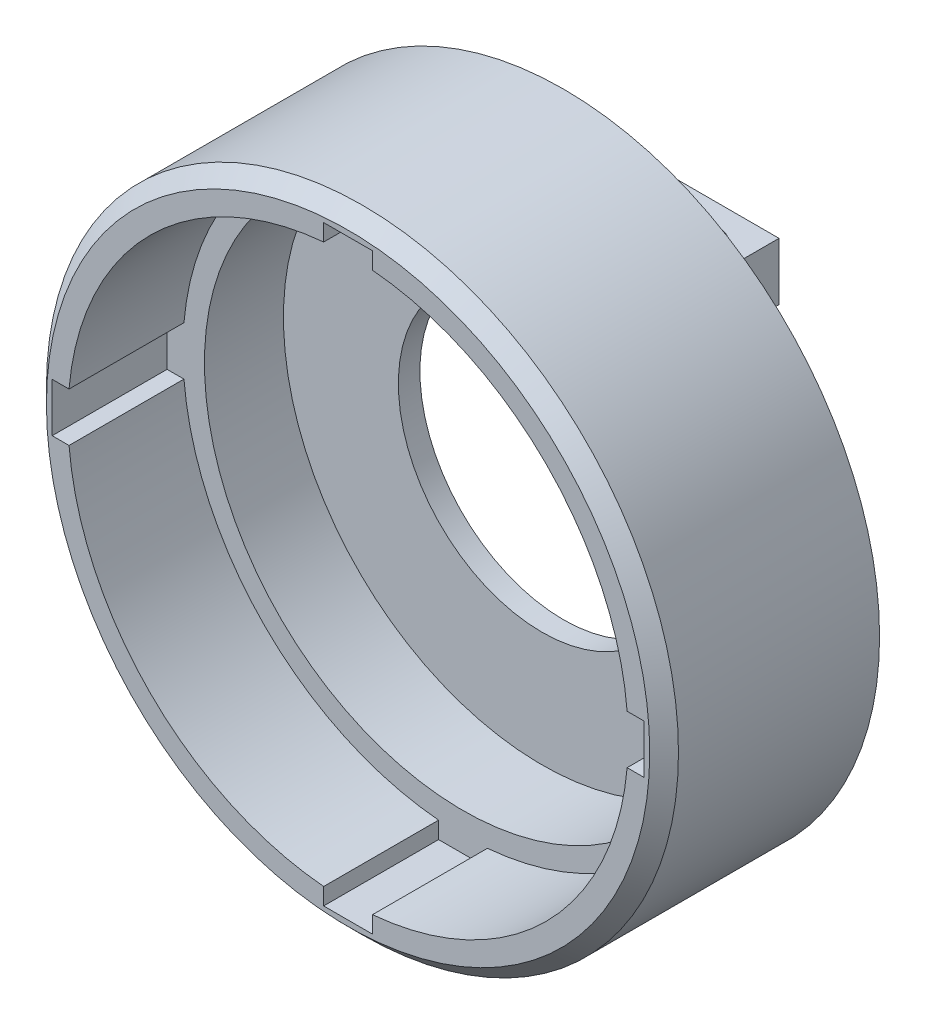
ISO-10303-21;
HEADER;
FILE_DESCRIPTION(('STEP AP214'),'2;1');
FILE_NAME('part.step','',(''),(''),'','','');
FILE_SCHEMA(('AUTOMOTIVE_DESIGN { 1 0 10303 214 1 1 1 1 }'));
ENDSEC;
DATA;
#1=APPLICATION_CONTEXT('core data for automotive mechanical design processes');
#2=APPLICATION_PROTOCOL_DEFINITION('international standard','automotive_design',2000,#1);
#3=PRODUCT_CONTEXT('',#1,'mechanical');
#4=PRODUCT('Part','Part','',(#3));
#5=PRODUCT_RELATED_PRODUCT_CATEGORY('part','',(#4));
#6=PRODUCT_DEFINITION_FORMATION('','',#4);
#7=PRODUCT_DEFINITION_CONTEXT('part definition',#1,'design');
#8=PRODUCT_DEFINITION('design','',#6,#7);
#9=PRODUCT_DEFINITION_SHAPE('','',#8);
#10=(LENGTH_UNIT() NAMED_UNIT(*) SI_UNIT(.MILLI.,.METRE.));
#11=(NAMED_UNIT(*) PLANE_ANGLE_UNIT() SI_UNIT($,.RADIAN.));
#12=(NAMED_UNIT(*) SI_UNIT($,.STERADIAN.) SOLID_ANGLE_UNIT());
#13=UNCERTAINTY_MEASURE_WITH_UNIT(LENGTH_MEASURE(1.E-05),#10,'distance_accuracy_value','');
#14=(GEOMETRIC_REPRESENTATION_CONTEXT(3) GLOBAL_UNCERTAINTY_ASSIGNED_CONTEXT((#13)) GLOBAL_UNIT_ASSIGNED_CONTEXT((#10,
#11,#12)) REPRESENTATION_CONTEXT('',''));
#15=CARTESIAN_POINT('',(0.,0.,0.));
#16=DIRECTION('',(0.,0.,1.));
#17=DIRECTION('',(1.,0.,0.));
#18=AXIS2_PLACEMENT_3D('',#15,#16,#17);
#19=CARTESIAN_POINT('',(0.,0.,-6.75));
#20=DIRECTION('',(0.,0.,-1.));
#21=DIRECTION('',(-1.,0.,0.));
#22=AXIS2_PLACEMENT_3D('',#19,#20,#21);
#23=PLANE('',#22);
#24=DIRECTION('',(0.,1.,0.));
#25=VECTOR('',#24,1.);
#26=CARTESIAN_POINT('',(-5.,0.,-6.75));
#27=LINE('',#26,#25);
#28=CARTESIAN_POINT('',(-5.,8.66025403784439,-6.75));
#29=VERTEX_POINT('',#28);
#30=CARTESIAN_POINT('',(-5.,11.5,-6.75));
#31=VERTEX_POINT('',#30);
#32=EDGE_CURVE('E265',#29,#31,#27,.T.);
#33=ORIENTED_EDGE('',*,*,#32,.F.);
#34=CARTESIAN_POINT('',(0.,0.,-6.75));
#35=DIRECTION('',(0.,0.,-1.));
#36=DIRECTION('',(-1.,0.,0.));
#37=AXIS2_PLACEMENT_3D('',#34,#35,#36);
#38=CIRCLE('',#37,10.);
#39=CARTESIAN_POINT('',(5.,8.66025403784439,-6.75));
#40=VERTEX_POINT('',#39);
#41=EDGE_CURVE('E294',#29,#40,#38,.F.);
#42=ORIENTED_EDGE('',*,*,#41,.T.);
#43=DIRECTION('',(0.,1.,0.));
#44=VECTOR('',#43,1.);
#45=CARTESIAN_POINT('',(5.,0.,-6.75));
#46=LINE('',#45,#44);
#47=CARTESIAN_POINT('',(5.,11.5,-6.75));
#48=VERTEX_POINT('',#47);
#49=EDGE_CURVE('E246',#40,#48,#46,.T.);
#50=ORIENTED_EDGE('',*,*,#49,.T.);
#51=DIRECTION('',(1.,0.,0.));
#52=VECTOR('',#51,1.);
#53=CARTESIAN_POINT('',(0.,11.5,-6.75));
#54=LINE('',#53,#52);
#55=CARTESIAN_POINT('',(9.99999999999999,11.5,-6.75));
#56=VERTEX_POINT('',#55);
#57=EDGE_CURVE('E250',#48,#56,#54,.T.);
#58=ORIENTED_EDGE('',*,*,#57,.T.);
#59=DIRECTION('',(0.,1.,0.));
#60=VECTOR('',#59,1.);
#61=CARTESIAN_POINT('',(9.99999999999997,0.,-6.75));
#62=LINE('',#61,#60);
#63=CARTESIAN_POINT('',(10.,15.5,-6.75));
#64=VERTEX_POINT('',#63);
#65=EDGE_CURVE('E276',#56,#64,#62,.T.);
#66=ORIENTED_EDGE('',*,*,#65,.T.);
#67=DIRECTION('',(-1.,0.,0.));
#68=VECTOR('',#67,1.);
#69=CARTESIAN_POINT('',(0.,15.5,-6.75));
#70=LINE('',#69,#68);
#71=CARTESIAN_POINT('',(-10.,15.5,-6.75));
#72=VERTEX_POINT('',#71);
#73=EDGE_CURVE('E273',#64,#72,#70,.T.);
#74=ORIENTED_EDGE('',*,*,#73,.T.);
#75=DIRECTION('',(0.,-1.,0.));
#76=VECTOR('',#75,1.);
#77=CARTESIAN_POINT('',(-10.,0.,-6.75));
#78=LINE('',#77,#76);
#79=CARTESIAN_POINT('',(-10.,11.5,-6.75));
#80=VERTEX_POINT('',#79);
#81=EDGE_CURVE('E270',#72,#80,#78,.T.);
#82=ORIENTED_EDGE('',*,*,#81,.T.);
#83=DIRECTION('',(1.,0.,0.));
#84=VECTOR('',#83,1.);
#85=CARTESIAN_POINT('',(0.,11.5,-6.75));
#86=LINE('',#85,#84);
#87=EDGE_CURVE('E267',#80,#31,#86,.T.);
#88=ORIENTED_EDGE('',*,*,#87,.T.);
#89=EDGE_LOOP('',(#33,#42,#50,#58,#66,#74,#82,#88));
#90=FACE_BOUND('',#89,.T.);
#91=CARTESIAN_POINT('',(0.,0.,-6.75));
#92=DIRECTION('',(0.,0.,-1.));
#93=DIRECTION('',(-1.,0.,0.));
#94=AXIS2_PLACEMENT_3D('',#91,#92,#93);
#95=CIRCLE('',#94,22.);
#96=CARTESIAN_POINT('',(-22.,0.,-6.75));
#97=VERTEX_POINT('',#96);
#98=EDGE_CURVE('E291',#97,#97,#95,.T.);
#99=ORIENTED_EDGE('',*,*,#98,.T.);
#100=EDGE_LOOP('',(#99));
#101=FACE_BOUND('',#100,.T.);
#102=ADVANCED_FACE('F35',(#90,#101),#23,.T.);
#103=CARTESIAN_POINT('',(0.,0.,8.25));
#104=DIRECTION('',(0.,0.,-1.));
#105=DIRECTION('',(-1.,0.,0.));
#106=AXIS2_PLACEMENT_3D('',#103,#104,#105);
#107=CYLINDRICAL_SURFACE('',#106,22.);
#108=CARTESIAN_POINT('',(0.,0.,7.24999999999999));
#109=DIRECTION('',(0.,0.,1.));
#110=DIRECTION('',(1.,0.,0.));
#111=AXIS2_PLACEMENT_3D('',#108,#109,#110);
#112=CIRCLE('',#111,22.);
#113=CARTESIAN_POINT('',(22.,0.,7.24999999999999));
#114=VERTEX_POINT('',#113);
#115=EDGE_CURVE('E44',#114,#114,#112,.F.);
#116=ORIENTED_EDGE('',*,*,#115,.T.);
#117=EDGE_LOOP('',(#116));
#118=FACE_BOUND('',#117,.T.);
#119=ORIENTED_EDGE('',*,*,#98,.F.);
#120=EDGE_LOOP('',(#119));
#121=FACE_BOUND('',#120,.T.);
#122=ADVANCED_FACE('F418',(#118,#121),#107,.T.);
#123=CARTESIAN_POINT('',(0.,0.,8.25));
#124=DIRECTION('',(0.,0.,-1.));
#125=DIRECTION('',(-1.,0.,0.));
#126=AXIS2_PLACEMENT_3D('',#123,#124,#125);
#127=CYLINDRICAL_SURFACE('',#126,10.);
#128=ORIENTED_EDGE('',*,*,#41,.F.);
#129=DIRECTION('',(0.,0.,-1.));
#130=VECTOR('',#129,1.);
#131=CARTESIAN_POINT('',(-5.,8.66025403784439,8.25));
#132=LINE('',#131,#130);
#133=CARTESIAN_POINT('',(-5.,8.66025403784439,-5.25));
#134=VERTEX_POINT('',#133);
#135=EDGE_CURVE('E240',#29,#134,#132,.F.);
#136=ORIENTED_EDGE('',*,*,#135,.T.);
#137=CARTESIAN_POINT('',(0.,0.,-5.25));
#138=DIRECTION('',(0.,0.,1.));
#139=DIRECTION('',(1.,0.,0.));
#140=AXIS2_PLACEMENT_3D('',#137,#138,#139);
#141=CIRCLE('',#140,10.);
#142=CARTESIAN_POINT('',(5.,8.66025403784439,-5.25));
#143=VERTEX_POINT('',#142);
#144=EDGE_CURVE('E357',#134,#143,#141,.T.);
#145=ORIENTED_EDGE('',*,*,#144,.T.);
#146=DIRECTION('',(0.,0.,-1.));
#147=VECTOR('',#146,1.);
#148=CARTESIAN_POINT('',(5.,8.66025403784439,8.25));
#149=LINE('',#148,#147);
#150=EDGE_CURVE('E237',#143,#40,#149,.T.);
#151=ORIENTED_EDGE('',*,*,#150,.T.);
#152=EDGE_LOOP('',(#128,#136,#145,#151));
#153=FACE_BOUND('',#152,.T.);
#154=ADVANCED_FACE('F498',(#153),#127,.F.);
#155=CARTESIAN_POINT('',(0.,0.,0.25));
#156=DIRECTION('',(0.,0.,1.));
#157=DIRECTION('',(1.,0.,0.));
#158=AXIS2_PLACEMENT_3D('',#155,#156,#157);
#159=CYLINDRICAL_SURFACE('',#158,19.5);
#160=CARTESIAN_POINT('',(0.,0.,0.25));
#161=DIRECTION('',(0.,0.,1.));
#162=DIRECTION('',(1.,0.,0.));
#163=AXIS2_PLACEMENT_3D('',#160,#161,#162);
#164=CIRCLE('',#163,19.5);
#165=CARTESIAN_POINT('',(-19.4257560985409,-1.70000000000007,0.25));
#166=VERTEX_POINT('',#165);
#167=CARTESIAN_POINT('',(-1.7,-19.4257560985409,0.25));
#168=VERTEX_POINT('',#167);
#169=EDGE_CURVE('E372',#166,#168,#164,.T.);
#170=ORIENTED_EDGE('',*,*,#169,.F.);
#171=DIRECTION('',(0.,0.,1.));
#172=VECTOR('',#171,1.);
#173=CARTESIAN_POINT('',(-19.4257560985409,-1.70000000000007,0.25));
#174=LINE('',#173,#172);
#175=CARTESIAN_POINT('',(-19.4257560985409,-1.70000000000007,8.25));
#176=VERTEX_POINT('',#175);
#177=EDGE_CURVE('E407',#166,#176,#174,.T.);
#178=ORIENTED_EDGE('',*,*,#177,.T.);
#179=CARTESIAN_POINT('',(0.,0.,8.25));
#180=DIRECTION('',(0.,0.,1.));
#181=DIRECTION('',(1.,0.,0.));
#182=AXIS2_PLACEMENT_3D('',#179,#180,#181);
#183=CIRCLE('',#182,19.5);
#184=CARTESIAN_POINT('',(-1.7,-19.4257560985409,8.25));
#185=VERTEX_POINT('',#184);
#186=EDGE_CURVE('E377',#176,#185,#183,.T.);
#187=ORIENTED_EDGE('',*,*,#186,.T.);
#188=DIRECTION('',(0.,0.,1.));
#189=VECTOR('',#188,1.);
#190=CARTESIAN_POINT('',(-1.7,-19.4257560985409,0.25));
#191=LINE('',#190,#189);
#192=EDGE_CURVE('E398',#185,#168,#191,.F.);
#193=ORIENTED_EDGE('',*,*,#192,.T.);
#194=EDGE_LOOP('',(#170,#178,#187,#193));
#195=FACE_BOUND('',#194,.T.);
#196=ADVANCED_FACE('F445',(#195),#159,.F.);
#197=CARTESIAN_POINT('',(1.7,-19.4257560985409,0.25));
#198=VERTEX_POINT('',#197);
#199=CARTESIAN_POINT('',(19.4257560985409,-1.6999999999998,0.25));
#200=VERTEX_POINT('',#199);
#201=EDGE_CURVE('E448',#198,#200,#164,.T.);
#202=ORIENTED_EDGE('',*,*,#201,.F.);
#203=DIRECTION('',(0.,0.,1.));
#204=VECTOR('',#203,1.);
#205=CARTESIAN_POINT('',(1.7,-19.4257560985409,0.25));
#206=LINE('',#205,#204);
#207=CARTESIAN_POINT('',(1.7,-19.4257560985409,8.25));
#208=VERTEX_POINT('',#207);
#209=EDGE_CURVE('E401',#198,#208,#206,.T.);
#210=ORIENTED_EDGE('',*,*,#209,.T.);
#211=CARTESIAN_POINT('',(19.4257560985409,-1.6999999999998,8.25));
#212=VERTEX_POINT('',#211);
#213=EDGE_CURVE('E464',#208,#212,#183,.T.);
#214=ORIENTED_EDGE('',*,*,#213,.T.);
#215=DIRECTION('',(0.,0.,1.));
#216=VECTOR('',#215,1.);
#217=CARTESIAN_POINT('',(19.4257560985409,-1.6999999999998,0.25));
#218=LINE('',#217,#216);
#219=EDGE_CURVE('E392',#212,#200,#218,.F.);
#220=ORIENTED_EDGE('',*,*,#219,.T.);
#221=EDGE_LOOP('',(#202,#210,#214,#220));
#222=FACE_BOUND('',#221,.T.);
#223=ADVANCED_FACE('F468',(#222),#159,.F.);
#224=CARTESIAN_POINT('',(19.4257560985409,1.7000000000002,0.25));
#225=VERTEX_POINT('',#224);
#226=CARTESIAN_POINT('',(1.7,19.4257560985409,0.25));
#227=VERTEX_POINT('',#226);
#228=EDGE_CURVE('E373',#225,#227,#164,.T.);
#229=ORIENTED_EDGE('',*,*,#228,.F.);
#230=DIRECTION('',(0.,0.,1.));
#231=VECTOR('',#230,1.);
#232=CARTESIAN_POINT('',(19.4257560985409,1.7000000000002,0.25));
#233=LINE('',#232,#231);
#234=CARTESIAN_POINT('',(19.4257560985409,1.7000000000002,8.25));
#235=VERTEX_POINT('',#234);
#236=EDGE_CURVE('E395',#225,#235,#233,.T.);
#237=ORIENTED_EDGE('',*,*,#236,.T.);
#238=CARTESIAN_POINT('',(1.7,19.4257560985409,8.25));
#239=VERTEX_POINT('',#238);
#240=EDGE_CURVE('E378',#235,#239,#183,.T.);
#241=ORIENTED_EDGE('',*,*,#240,.T.);
#242=DIRECTION('',(0.,0.,1.));
#243=VECTOR('',#242,1.);
#244=CARTESIAN_POINT('',(1.7,19.4257560985409,0.25));
#245=LINE('',#244,#243);
#246=EDGE_CURVE('E382',#239,#227,#245,.F.);
#247=ORIENTED_EDGE('',*,*,#246,.T.);
#248=EDGE_LOOP('',(#229,#237,#241,#247));
#249=FACE_BOUND('',#248,.T.);
#250=ADVANCED_FACE('F431',(#249),#159,.F.);
#251=CARTESIAN_POINT('',(0.,0.,8.25));
#252=DIRECTION('',(0.,0.,1.));
#253=DIRECTION('',(1.,0.,0.));
#254=AXIS2_PLACEMENT_3D('',#251,#252,#253);
#255=PLANE('',#254);
#256=CARTESIAN_POINT('',(0.,0.,8.25));
#257=DIRECTION('',(0.,0.,1.));
#258=DIRECTION('',(1.,0.,0.));
#259=AXIS2_PLACEMENT_3D('',#256,#257,#258);
#260=CIRCLE('',#259,21.);
#261=CARTESIAN_POINT('',(21.,0.,8.25));
#262=VERTEX_POINT('',#261);
#263=EDGE_CURVE('E410',#262,#262,#260,.T.);
#264=ORIENTED_EDGE('',*,*,#263,.T.);
#265=EDGE_LOOP('',(#264));
#266=FACE_BOUND('',#265,.T.);
#267=DIRECTION('',(1.,0.,0.));
#268=VECTOR('',#267,1.);
#269=CARTESIAN_POINT('',(-20.6,-1.70000000000007,8.25));
#270=LINE('',#269,#268);
#271=CARTESIAN_POINT('',(-20.6,-1.70000000000007,8.25));
#272=VERTEX_POINT('',#271);
#273=EDGE_CURVE('E303',#272,#176,#270,.T.);
#274=ORIENTED_EDGE('',*,*,#273,.F.);
#275=DIRECTION('',(0.,-1.,0.));
#276=VECTOR('',#275,1.);
#277=CARTESIAN_POINT('',(-20.6,1.69999999999993,8.25));
#278=LINE('',#277,#276);
#279=CARTESIAN_POINT('',(-20.6,1.69999999999993,8.25));
#280=VERTEX_POINT('',#279);
#281=EDGE_CURVE('E308',#280,#272,#278,.T.);
#282=ORIENTED_EDGE('',*,*,#281,.F.);
#283=DIRECTION('',(-1.,0.,0.));
#284=VECTOR('',#283,1.);
#285=CARTESIAN_POINT('',(-20.6,1.69999999999993,8.25));
#286=LINE('',#285,#284);
#287=CARTESIAN_POINT('',(-19.4257560985409,1.69999999999993,8.25));
#288=VERTEX_POINT('',#287);
#289=EDGE_CURVE('E305',#288,#280,#286,.T.);
#290=ORIENTED_EDGE('',*,*,#289,.F.);
#291=CARTESIAN_POINT('',(-1.7,19.4257560985409,8.25));
#292=VERTEX_POINT('',#291);
#293=EDGE_CURVE('E374',#292,#288,#183,.T.);
#294=ORIENTED_EDGE('',*,*,#293,.F.);
#295=DIRECTION('',(0.,-1.,0.));
#296=VECTOR('',#295,1.);
#297=CARTESIAN_POINT('',(-1.7,20.6,8.25));
#298=LINE('',#297,#296);
#299=CARTESIAN_POINT('',(-1.7,20.6,8.25));
#300=VERTEX_POINT('',#299);
#301=EDGE_CURVE('E302',#300,#292,#298,.T.);
#302=ORIENTED_EDGE('',*,*,#301,.F.);
#303=DIRECTION('',(-1.,0.,0.));
#304=VECTOR('',#303,1.);
#305=CARTESIAN_POINT('',(1.7,20.6,8.25));
#306=LINE('',#305,#304);
#307=CARTESIAN_POINT('',(1.7,20.6,8.25));
#308=VERTEX_POINT('',#307);
#309=EDGE_CURVE('E361',#308,#300,#306,.T.);
#310=ORIENTED_EDGE('',*,*,#309,.F.);
#311=DIRECTION('',(0.,1.,0.));
#312=VECTOR('',#311,1.);
#313=CARTESIAN_POINT('',(1.7,20.6,8.25));
#314=LINE('',#313,#312);
#315=EDGE_CURVE('E359',#239,#308,#314,.T.);
#316=ORIENTED_EDGE('',*,*,#315,.F.);
#317=ORIENTED_EDGE('',*,*,#240,.F.);
#318=DIRECTION('',(-1.,0.,0.));
#319=VECTOR('',#318,1.);
#320=CARTESIAN_POINT('',(20.6,1.70000000000021,8.25));
#321=LINE('',#320,#319);
#322=CARTESIAN_POINT('',(20.6,1.70000000000021,8.25));
#323=VERTEX_POINT('',#322);
#324=EDGE_CURVE('E338',#323,#235,#321,.T.);
#325=ORIENTED_EDGE('',*,*,#324,.F.);
#326=DIRECTION('',(0.,1.,0.));
#327=VECTOR('',#326,1.);
#328=CARTESIAN_POINT('',(20.6,-1.69999999999979,8.25));
#329=LINE('',#328,#327);
#330=CARTESIAN_POINT('',(20.6,-1.69999999999979,8.25));
#331=VERTEX_POINT('',#330);
#332=EDGE_CURVE('E342',#331,#323,#329,.T.);
#333=ORIENTED_EDGE('',*,*,#332,.F.);
#334=DIRECTION('',(1.,0.,0.));
#335=VECTOR('',#334,1.);
#336=CARTESIAN_POINT('',(20.6,-1.69999999999979,8.25));
#337=LINE('',#336,#335);
#338=EDGE_CURVE('E340',#212,#331,#337,.T.);
#339=ORIENTED_EDGE('',*,*,#338,.F.);
#340=ORIENTED_EDGE('',*,*,#213,.F.);
#341=DIRECTION('',(0.,1.,0.));
#342=VECTOR('',#341,1.);
#343=CARTESIAN_POINT('',(1.7,-20.6,8.25));
#344=LINE('',#343,#342);
#345=CARTESIAN_POINT('',(1.7,-20.6,8.25));
#346=VERTEX_POINT('',#345);
#347=EDGE_CURVE('E321',#346,#208,#344,.T.);
#348=ORIENTED_EDGE('',*,*,#347,.F.);
#349=DIRECTION('',(1.,0.,0.));
#350=VECTOR('',#349,1.);
#351=CARTESIAN_POINT('',(-1.7,-20.6,8.25));
#352=LINE('',#351,#350);
#353=CARTESIAN_POINT('',(-1.7,-20.6,8.25));
#354=VERTEX_POINT('',#353);
#355=EDGE_CURVE('E325',#354,#346,#352,.T.);
#356=ORIENTED_EDGE('',*,*,#355,.F.);
#357=DIRECTION('',(0.,-1.,0.));
#358=VECTOR('',#357,1.);
#359=CARTESIAN_POINT('',(-1.7,-20.6,8.25));
#360=LINE('',#359,#358);
#361=EDGE_CURVE('E323',#185,#354,#360,.T.);
#362=ORIENTED_EDGE('',*,*,#361,.F.);
#363=ORIENTED_EDGE('',*,*,#186,.F.);
#364=EDGE_LOOP('',(#274,#282,#290,#294,#302,#310,#316,#317,#325,#333,#339,#340,#348,#356,#362,#363));
#365=FACE_BOUND('',#364,.T.);
#366=ADVANCED_FACE('F427',(#266,#365),#255,.T.);
#367=CARTESIAN_POINT('',(0.,0.,0.25));
#368=DIRECTION('',(0.,0.,1.));
#369=DIRECTION('',(1.,0.,0.));
#370=AXIS2_PLACEMENT_3D('',#367,#368,#369);
#371=PLANE('',#370);
#372=CARTESIAN_POINT('',(-1.7,19.4257560985409,0.25));
#373=VERTEX_POINT('',#372);
#374=CARTESIAN_POINT('',(-19.4257560985409,1.69999999999993,0.25));
#375=VERTEX_POINT('',#374);
#376=EDGE_CURVE('E368',#373,#375,#164,.T.);
#377=ORIENTED_EDGE('',*,*,#376,.T.);
#378=DIRECTION('',(1.,0.,0.));
#379=VECTOR('',#378,1.);
#380=CARTESIAN_POINT('',(-20.6,1.69999999999993,0.25));
#381=LINE('',#380,#379);
#382=CARTESIAN_POINT('',(-20.6,1.69999999999993,0.25));
#383=VERTEX_POINT('',#382);
#384=EDGE_CURVE('E295',#383,#375,#381,.T.);
#385=ORIENTED_EDGE('',*,*,#384,.F.);
#386=DIRECTION('',(0.,1.,0.));
#387=VECTOR('',#386,1.);
#388=CARTESIAN_POINT('',(-20.6,1.69999999999993,0.25));
#389=LINE('',#388,#387);
#390=CARTESIAN_POINT('',(-20.6,-1.70000000000007,0.25));
#391=VERTEX_POINT('',#390);
#392=EDGE_CURVE('E297',#391,#383,#389,.T.);
#393=ORIENTED_EDGE('',*,*,#392,.F.);
#394=DIRECTION('',(-1.,0.,0.));
#395=VECTOR('',#394,1.);
#396=CARTESIAN_POINT('',(-20.6,-1.70000000000007,0.25));
#397=LINE('',#396,#395);
#398=EDGE_CURVE('E300',#166,#391,#397,.T.);
#399=ORIENTED_EDGE('',*,*,#398,.F.);
#400=ORIENTED_EDGE('',*,*,#169,.T.);
#401=DIRECTION('',(0.,1.,0.));
#402=VECTOR('',#401,1.);
#403=CARTESIAN_POINT('',(-1.7,-20.6,0.25));
#404=LINE('',#403,#402);
#405=CARTESIAN_POINT('',(-1.7,-20.6,0.25));
#406=VERTEX_POINT('',#405);
#407=EDGE_CURVE('E315',#406,#168,#404,.T.);
#408=ORIENTED_EDGE('',*,*,#407,.F.);
#409=DIRECTION('',(-1.,0.,0.));
#410=VECTOR('',#409,1.);
#411=CARTESIAN_POINT('',(-1.7,-20.6,0.25));
#412=LINE('',#411,#410);
#413=CARTESIAN_POINT('',(1.7,-20.6,0.25));
#414=VERTEX_POINT('',#413);
#415=EDGE_CURVE('E317',#414,#406,#412,.T.);
#416=ORIENTED_EDGE('',*,*,#415,.F.);
#417=DIRECTION('',(0.,-1.,0.));
#418=VECTOR('',#417,1.);
#419=CARTESIAN_POINT('',(1.7,-20.6,0.25));
#420=LINE('',#419,#418);
#421=EDGE_CURVE('E306',#198,#414,#420,.T.);
#422=ORIENTED_EDGE('',*,*,#421,.F.);
#423=ORIENTED_EDGE('',*,*,#201,.T.);
#424=DIRECTION('',(-1.,0.,0.));
#425=VECTOR('',#424,1.);
#426=CARTESIAN_POINT('',(20.6,-1.69999999999979,0.25));
#427=LINE('',#426,#425);
#428=CARTESIAN_POINT('',(20.6,-1.69999999999979,0.25));
#429=VERTEX_POINT('',#428);
#430=EDGE_CURVE('E332',#429,#200,#427,.T.);
#431=ORIENTED_EDGE('',*,*,#430,.F.);
#432=DIRECTION('',(0.,-1.,0.));
#433=VECTOR('',#432,1.);
#434=CARTESIAN_POINT('',(20.6,-1.69999999999979,0.25));
#435=LINE('',#434,#433);
#436=CARTESIAN_POINT('',(20.6,1.70000000000021,0.25));
#437=VERTEX_POINT('',#436);
#438=EDGE_CURVE('E334',#437,#429,#435,.T.);
#439=ORIENTED_EDGE('',*,*,#438,.F.);
#440=DIRECTION('',(1.,0.,0.));
#441=VECTOR('',#440,1.);
#442=CARTESIAN_POINT('',(20.6,1.70000000000021,0.25));
#443=LINE('',#442,#441);
#444=EDGE_CURVE('E59',#225,#437,#443,.T.);
#445=ORIENTED_EDGE('',*,*,#444,.F.);
#446=ORIENTED_EDGE('',*,*,#228,.T.);
#447=DIRECTION('',(0.,-1.,0.));
#448=VECTOR('',#447,1.);
#449=CARTESIAN_POINT('',(1.7,20.6,0.25));
#450=LINE('',#449,#448);
#451=CARTESIAN_POINT('',(1.7,20.6,0.25));
#452=VERTEX_POINT('',#451);
#453=EDGE_CURVE('E349',#452,#227,#450,.T.);
#454=ORIENTED_EDGE('',*,*,#453,.F.);
#455=DIRECTION('',(1.,0.,0.));
#456=VECTOR('',#455,1.);
#457=CARTESIAN_POINT('',(1.7,20.6,0.25));
#458=LINE('',#457,#456);
#459=CARTESIAN_POINT('',(-1.7,20.6,0.25));
#460=VERTEX_POINT('',#459);
#461=EDGE_CURVE('E352',#460,#452,#458,.T.);
#462=ORIENTED_EDGE('',*,*,#461,.F.);
#463=DIRECTION('',(0.,1.,0.));
#464=VECTOR('',#463,1.);
#465=CARTESIAN_POINT('',(-1.7,20.6,0.25));
#466=LINE('',#465,#464);
#467=EDGE_CURVE('E355',#373,#460,#466,.T.);
#468=ORIENTED_EDGE('',*,*,#467,.F.);
#469=EDGE_LOOP('',(#377,#385,#393,#399,#400,#408,#416,#422,#423,#431,#439,#445,#446,#454,#462,#468));
#470=FACE_BOUND('',#469,.T.);
#471=CARTESIAN_POINT('',(0.,0.,0.25));
#472=DIRECTION('',(0.,0.,1.));
#473=DIRECTION('',(1.,0.,0.));
#474=AXIS2_PLACEMENT_3D('',#471,#472,#473);
#475=CIRCLE('',#474,18.);
#476=CARTESIAN_POINT('',(18.,0.,0.25));
#477=VERTEX_POINT('',#476);
#478=EDGE_CURVE('E371',#477,#477,#475,.F.);
#479=ORIENTED_EDGE('',*,*,#478,.T.);
#480=EDGE_LOOP('',(#479));
#481=FACE_BOUND('',#480,.T.);
#482=ADVANCED_FACE('F430',(#470,#481),#371,.T.);
#483=ORIENTED_EDGE('',*,*,#293,.T.);
#484=DIRECTION('',(0.,0.,1.));
#485=VECTOR('',#484,1.);
#486=CARTESIAN_POINT('',(-19.4257560985409,1.69999999999993,0.25));
#487=LINE('',#486,#485);
#488=EDGE_CURVE('E404',#288,#375,#487,.F.);
#489=ORIENTED_EDGE('',*,*,#488,.T.);
#490=ORIENTED_EDGE('',*,*,#376,.F.);
#491=DIRECTION('',(0.,0.,1.));
#492=VECTOR('',#491,1.);
#493=CARTESIAN_POINT('',(-1.7,19.4257560985409,0.25));
#494=LINE('',#493,#492);
#495=EDGE_CURVE('E389',#373,#292,#494,.T.);
#496=ORIENTED_EDGE('',*,*,#495,.T.);
#497=EDGE_LOOP('',(#483,#489,#490,#496));
#498=FACE_BOUND('',#497,.T.);
#499=ADVANCED_FACE('F702',(#498),#159,.F.);
#500=CARTESIAN_POINT('',(0.,0.,-5.25));
#501=DIRECTION('',(0.,0.,1.));
#502=DIRECTION('',(1.,0.,0.));
#503=AXIS2_PLACEMENT_3D('',#500,#501,#502);
#504=PLANE('',#503);
#505=DIRECTION('',(0.,-1.,0.));
#506=VECTOR('',#505,1.);
#507=CARTESIAN_POINT('',(-5.,0.,-5.25));
#508=LINE('',#507,#506);
#509=CARTESIAN_POINT('',(-5.,13.5,-5.25));
#510=VERTEX_POINT('',#509);
#511=EDGE_CURVE('E243',#510,#134,#508,.T.);
#512=ORIENTED_EDGE('',*,*,#511,.F.);
#513=DIRECTION('',(-1.,0.,0.));
#514=VECTOR('',#513,1.);
#515=CARTESIAN_POINT('',(0.,13.5,-5.25));
#516=LINE('',#515,#514);
#517=CARTESIAN_POINT('',(5.,13.5,-5.25));
#518=VERTEX_POINT('',#517);
#519=EDGE_CURVE('E211',#518,#510,#516,.T.);
#520=ORIENTED_EDGE('',*,*,#519,.F.);
#521=DIRECTION('',(0.,1.,0.));
#522=VECTOR('',#521,1.);
#523=CARTESIAN_POINT('',(5.,0.,-5.25));
#524=LINE('',#523,#522);
#525=EDGE_CURVE('E214',#143,#518,#524,.T.);
#526=ORIENTED_EDGE('',*,*,#525,.F.);
#527=ORIENTED_EDGE('',*,*,#144,.F.);
#528=EDGE_LOOP('',(#512,#520,#526,#527));
#529=FACE_BOUND('',#528,.T.);
#530=CARTESIAN_POINT('',(0.,0.,-5.25));
#531=DIRECTION('',(0.,0.,1.));
#532=DIRECTION('',(1.,0.,0.));
#533=AXIS2_PLACEMENT_3D('',#530,#531,#532);
#534=CIRCLE('',#533,18.);
#535=CARTESIAN_POINT('',(18.,0.,-5.25));
#536=VERTEX_POINT('',#535);
#537=EDGE_CURVE('E379',#536,#536,#534,.T.);
#538=ORIENTED_EDGE('',*,*,#537,.T.);
#539=EDGE_LOOP('',(#538));
#540=FACE_BOUND('',#539,.T.);
#541=ADVANCED_FACE('F709',(#529,#540),#504,.T.);
#542=CARTESIAN_POINT('',(0.,0.,-5.25));
#543=DIRECTION('',(0.,0.,1.));
#544=DIRECTION('',(1.,0.,0.));
#545=AXIS2_PLACEMENT_3D('',#542,#543,#544);
#546=CYLINDRICAL_SURFACE('',#545,18.);
#547=ORIENTED_EDGE('',*,*,#537,.F.);
#548=EDGE_LOOP('',(#547));
#549=FACE_BOUND('',#548,.T.);
#550=ORIENTED_EDGE('',*,*,#478,.F.);
#551=EDGE_LOOP('',(#550));
#552=FACE_BOUND('',#551,.T.);
#553=ADVANCED_FACE('F716',(#549,#552),#546,.F.);
#554=CARTESIAN_POINT('',(-1.7,20.6,-3.79969134626332));
#555=DIRECTION('',(-1.,0.,0.));
#556=DIRECTION('',(0.,-1.,0.));
#557=AXIS2_PLACEMENT_3D('',#554,#555,#556);
#558=PLANE('',#557);
#559=ORIENTED_EDGE('',*,*,#467,.T.);
#560=DIRECTION('',(0.,0.,1.));
#561=VECTOR('',#560,1.);
#562=CARTESIAN_POINT('',(-1.7,20.6,-3.79969134626332));
#563=LINE('',#562,#561);
#564=EDGE_CURVE('E353',#460,#300,#563,.T.);
#565=ORIENTED_EDGE('',*,*,#564,.T.);
#566=ORIENTED_EDGE('',*,*,#301,.T.);
#567=ORIENTED_EDGE('',*,*,#495,.F.);
#568=EDGE_LOOP('',(#559,#565,#566,#567));
#569=FACE_BOUND('',#568,.T.);
#570=ADVANCED_FACE('F723',(#569),#558,.F.);
#571=CARTESIAN_POINT('',(1.7,20.6,-3.79969134626332));
#572=DIRECTION('',(1.,0.,0.));
#573=DIRECTION('',(0.,1.,0.));
#574=AXIS2_PLACEMENT_3D('',#571,#572,#573);
#575=PLANE('',#574);
#576=ORIENTED_EDGE('',*,*,#315,.T.);
#577=DIRECTION('',(0.,0.,1.));
#578=VECTOR('',#577,1.);
#579=CARTESIAN_POINT('',(1.7,20.6,-3.79969134626332));
#580=LINE('',#579,#578);
#581=EDGE_CURVE('E364',#452,#308,#580,.T.);
#582=ORIENTED_EDGE('',*,*,#581,.F.);
#583=ORIENTED_EDGE('',*,*,#453,.T.);
#584=ORIENTED_EDGE('',*,*,#246,.F.);
#585=EDGE_LOOP('',(#576,#582,#583,#584));
#586=FACE_BOUND('',#585,.T.);
#587=ADVANCED_FACE('F460',(#586),#575,.F.);
#588=CARTESIAN_POINT('',(1.7,20.6,-3.79969134626332));
#589=DIRECTION('',(0.,1.,0.));
#590=DIRECTION('',(0.,0.,1.));
#591=AXIS2_PLACEMENT_3D('',#588,#589,#590);
#592=PLANE('',#591);
#593=ORIENTED_EDGE('',*,*,#461,.T.);
#594=ORIENTED_EDGE('',*,*,#581,.T.);
#595=ORIENTED_EDGE('',*,*,#309,.T.);
#596=ORIENTED_EDGE('',*,*,#564,.F.);
#597=EDGE_LOOP('',(#593,#594,#595,#596));
#598=FACE_BOUND('',#597,.T.);
#599=ADVANCED_FACE('F483',(#598),#592,.F.);
#600=CARTESIAN_POINT('',(20.6,1.70000000000021,-3.79969134626336));
#601=DIRECTION('',(0.,1.,0.));
#602=DIRECTION('',(-1.,0.,0.));
#603=AXIS2_PLACEMENT_3D('',#600,#601,#602);
#604=PLANE('',#603);
#605=ORIENTED_EDGE('',*,*,#444,.T.);
#606=DIRECTION('',(0.,0.,1.));
#607=VECTOR('',#606,1.);
#608=CARTESIAN_POINT('',(20.6,1.70000000000021,-3.79969134626336));
#609=LINE('',#608,#607);
#610=EDGE_CURVE('E335',#437,#323,#609,.T.);
#611=ORIENTED_EDGE('',*,*,#610,.T.);
#612=ORIENTED_EDGE('',*,*,#324,.T.);
#613=ORIENTED_EDGE('',*,*,#236,.F.);
#614=EDGE_LOOP('',(#605,#611,#612,#613));
#615=FACE_BOUND('',#614,.T.);
#616=ADVANCED_FACE('F481',(#615),#604,.F.);
#617=CARTESIAN_POINT('',(20.6,-1.69999999999979,-3.79969134626336));
#618=DIRECTION('',(0.,-1.,0.));
#619=DIRECTION('',(1.,0.,0.));
#620=AXIS2_PLACEMENT_3D('',#617,#618,#619);
#621=PLANE('',#620);
#622=ORIENTED_EDGE('',*,*,#338,.T.);
#623=DIRECTION('',(0.,0.,1.));
#624=VECTOR('',#623,1.);
#625=CARTESIAN_POINT('',(20.6,-1.69999999999979,-3.79969134626336));
#626=LINE('',#625,#624);
#627=EDGE_CURVE('E345',#429,#331,#626,.T.);
#628=ORIENTED_EDGE('',*,*,#627,.F.);
#629=ORIENTED_EDGE('',*,*,#430,.T.);
#630=ORIENTED_EDGE('',*,*,#219,.F.);
#631=EDGE_LOOP('',(#622,#628,#629,#630));
#632=FACE_BOUND('',#631,.T.);
#633=ADVANCED_FACE('F476',(#632),#621,.F.);
#634=CARTESIAN_POINT('',(20.6,-1.69999999999979,-3.79969134626336));
#635=DIRECTION('',(1.,0.,0.));
#636=DIRECTION('',(0.,1.,0.));
#637=AXIS2_PLACEMENT_3D('',#634,#635,#636);
#638=PLANE('',#637);
#639=ORIENTED_EDGE('',*,*,#438,.T.);
#640=ORIENTED_EDGE('',*,*,#627,.T.);
#641=ORIENTED_EDGE('',*,*,#332,.T.);
#642=ORIENTED_EDGE('',*,*,#610,.F.);
#643=EDGE_LOOP('',(#639,#640,#641,#642));
#644=FACE_BOUND('',#643,.T.);
#645=ADVANCED_FACE('F478',(#644),#638,.F.);
#646=CARTESIAN_POINT('',(1.7,-20.6,-3.79969134626332));
#647=DIRECTION('',(1.,0.,0.));
#648=DIRECTION('',(0.,1.,0.));
#649=AXIS2_PLACEMENT_3D('',#646,#647,#648);
#650=PLANE('',#649);
#651=ORIENTED_EDGE('',*,*,#421,.T.);
#652=DIRECTION('',(0.,0.,1.));
#653=VECTOR('',#652,1.);
#654=CARTESIAN_POINT('',(1.7,-20.6,-3.79969134626332));
#655=LINE('',#654,#653);
#656=EDGE_CURVE('E318',#414,#346,#655,.T.);
#657=ORIENTED_EDGE('',*,*,#656,.T.);
#658=ORIENTED_EDGE('',*,*,#347,.T.);
#659=ORIENTED_EDGE('',*,*,#209,.F.);
#660=EDGE_LOOP('',(#651,#657,#658,#659));
#661=FACE_BOUND('',#660,.T.);
#662=ADVANCED_FACE('F519',(#661),#650,.F.);
#663=CARTESIAN_POINT('',(-1.7,-20.6,-3.79969134626332));
#664=DIRECTION('',(-1.,0.,0.));
#665=DIRECTION('',(0.,-1.,0.));
#666=AXIS2_PLACEMENT_3D('',#663,#664,#665);
#667=PLANE('',#666);
#668=ORIENTED_EDGE('',*,*,#361,.T.);
#669=DIRECTION('',(0.,0.,1.));
#670=VECTOR('',#669,1.);
#671=CARTESIAN_POINT('',(-1.7,-20.6,-3.79969134626332));
#672=LINE('',#671,#670);
#673=EDGE_CURVE('E328',#406,#354,#672,.T.);
#674=ORIENTED_EDGE('',*,*,#673,.F.);
#675=ORIENTED_EDGE('',*,*,#407,.T.);
#676=ORIENTED_EDGE('',*,*,#192,.F.);
#677=EDGE_LOOP('',(#668,#674,#675,#676));
#678=FACE_BOUND('',#677,.T.);
#679=ADVANCED_FACE('F515',(#678),#667,.F.);
#680=CARTESIAN_POINT('',(-1.7,-20.6,-3.79969134626332));
#681=DIRECTION('',(0.,-1.,0.));
#682=DIRECTION('',(0.,0.,-1.));
#683=AXIS2_PLACEMENT_3D('',#680,#681,#682);
#684=PLANE('',#683);
#685=ORIENTED_EDGE('',*,*,#415,.T.);
#686=ORIENTED_EDGE('',*,*,#673,.T.);
#687=ORIENTED_EDGE('',*,*,#355,.T.);
#688=ORIENTED_EDGE('',*,*,#656,.F.);
#689=EDGE_LOOP('',(#685,#686,#687,#688));
#690=FACE_BOUND('',#689,.T.);
#691=ADVANCED_FACE('F512',(#690),#684,.F.);
#692=CARTESIAN_POINT('',(-20.6,-1.70000000000007,-3.79969134626333));
#693=DIRECTION('',(0.,-1.,0.));
#694=DIRECTION('',(1.,0.,0.));
#695=AXIS2_PLACEMENT_3D('',#692,#693,#694);
#696=PLANE('',#695);
#697=ORIENTED_EDGE('',*,*,#398,.T.);
#698=DIRECTION('',(0.,0.,1.));
#699=VECTOR('',#698,1.);
#700=CARTESIAN_POINT('',(-20.6,-1.70000000000007,-3.79969134626333));
#701=LINE('',#700,#699);
#702=EDGE_CURVE('E298',#391,#272,#701,.T.);
#703=ORIENTED_EDGE('',*,*,#702,.T.);
#704=ORIENTED_EDGE('',*,*,#273,.T.);
#705=ORIENTED_EDGE('',*,*,#177,.F.);
#706=EDGE_LOOP('',(#697,#703,#704,#705));
#707=FACE_BOUND('',#706,.T.);
#708=ADVANCED_FACE('F441',(#707),#696,.F.);
#709=CARTESIAN_POINT('',(-20.6,1.69999999999993,-3.79969134626333));
#710=DIRECTION('',(0.,1.,0.));
#711=DIRECTION('',(-1.,0.,0.));
#712=AXIS2_PLACEMENT_3D('',#709,#710,#711);
#713=PLANE('',#712);
#714=ORIENTED_EDGE('',*,*,#289,.T.);
#715=DIRECTION('',(0.,0.,1.));
#716=VECTOR('',#715,1.);
#717=CARTESIAN_POINT('',(-20.6,1.69999999999993,-3.79969134626333));
#718=LINE('',#717,#716);
#719=EDGE_CURVE('E311',#383,#280,#718,.T.);
#720=ORIENTED_EDGE('',*,*,#719,.F.);
#721=ORIENTED_EDGE('',*,*,#384,.T.);
#722=ORIENTED_EDGE('',*,*,#488,.F.);
#723=EDGE_LOOP('',(#714,#720,#721,#722));
#724=FACE_BOUND('',#723,.T.);
#725=ADVANCED_FACE('F505',(#724),#713,.F.);
#726=CARTESIAN_POINT('',(-20.6,1.69999999999993,-3.79969134626333));
#727=DIRECTION('',(-1.,0.,0.));
#728=DIRECTION('',(0.,-1.,0.));
#729=AXIS2_PLACEMENT_3D('',#726,#727,#728);
#730=PLANE('',#729);
#731=ORIENTED_EDGE('',*,*,#392,.T.);
#732=ORIENTED_EDGE('',*,*,#719,.T.);
#733=ORIENTED_EDGE('',*,*,#281,.T.);
#734=ORIENTED_EDGE('',*,*,#702,.F.);
#735=EDGE_LOOP('',(#731,#732,#733,#734));
#736=FACE_BOUND('',#735,.T.);
#737=ADVANCED_FACE('F424',(#736),#730,.F.);
#738=CARTESIAN_POINT('',(0.,0.,8.25));
#739=DIRECTION('',(0.,0.,-1.));
#740=DIRECTION('',(-1.,0.,0.));
#741=AXIS2_PLACEMENT_3D('',#738,#739,#740);
#742=CONICAL_SURFACE('',#741,21.,0.785398163397448);
#743=ORIENTED_EDGE('',*,*,#115,.F.);
#744=EDGE_LOOP('',(#743));
#745=FACE_BOUND('',#744,.T.);
#746=ORIENTED_EDGE('',*,*,#263,.F.);
#747=EDGE_LOOP('',(#746));
#748=FACE_BOUND('',#747,.T.);
#749=ADVANCED_FACE('F37',(#745,#748),#742,.T.);
#750=CARTESIAN_POINT('',(0.,11.5,-11.75));
#751=DIRECTION('',(0.,-1.,0.));
#752=DIRECTION('',(0.,0.,-1.));
#753=AXIS2_PLACEMENT_3D('',#750,#751,#752);
#754=PLANE('',#753);
#755=CARTESIAN_POINT('',(-7.5,11.5,-9.25));
#756=DIRECTION('',(0.,-1.,0.));
#757=DIRECTION('',(0.,0.,-1.));
#758=AXIS2_PLACEMENT_3D('',#755,#756,#757);
#759=CIRCLE('',#758,1.);
#760=CARTESIAN_POINT('',(-7.5,11.5,-10.25));
#761=VERTEX_POINT('',#760);
#762=EDGE_CURVE('E843',#761,#761,#759,.T.);
#763=ORIENTED_EDGE('',*,*,#762,.F.);
#764=EDGE_LOOP('',(#763));
#765=FACE_BOUND('',#764,.T.);
#766=ORIENTED_EDGE('',*,*,#87,.F.);
#767=DIRECTION('',(0.,0.,1.));
#768=VECTOR('',#767,1.);
#769=CARTESIAN_POINT('',(-10.,11.5,-11.75));
#770=LINE('',#769,#768);
#771=CARTESIAN_POINT('',(-10.,11.5,-11.75));
#772=VERTEX_POINT('',#771);
#773=EDGE_CURVE('E288',#772,#80,#770,.T.);
#774=ORIENTED_EDGE('',*,*,#773,.F.);
#775=DIRECTION('',(1.,0.,0.));
#776=VECTOR('',#775,1.);
#777=CARTESIAN_POINT('',(0.,11.5,-11.75));
#778=LINE('',#777,#776);
#779=CARTESIAN_POINT('',(-5.,11.5,-11.75));
#780=VERTEX_POINT('',#779);
#781=EDGE_CURVE('E247',#772,#780,#778,.T.);
#782=ORIENTED_EDGE('',*,*,#781,.T.);
#783=DIRECTION('',(0.,0.,1.));
#784=VECTOR('',#783,1.);
#785=CARTESIAN_POINT('',(-5.,11.5,-11.75));
#786=LINE('',#785,#784);
#787=EDGE_CURVE('E220',#780,#31,#786,.T.);
#788=ORIENTED_EDGE('',*,*,#787,.T.);
#789=EDGE_LOOP('',(#766,#774,#782,#788));
#790=FACE_BOUND('',#789,.T.);
#791=ADVANCED_FACE('F423',(#765,#790),#754,.T.);
#792=CARTESIAN_POINT('',(-10.,0.,-11.75));
#793=DIRECTION('',(-1.,0.,0.));
#794=DIRECTION('',(0.,0.,1.));
#795=AXIS2_PLACEMENT_3D('',#792,#793,#794);
#796=PLANE('',#795);
#797=ORIENTED_EDGE('',*,*,#81,.F.);
#798=DIRECTION('',(0.,0.,1.));
#799=VECTOR('',#798,1.);
#800=CARTESIAN_POINT('',(-10.,15.5,-11.75));
#801=LINE('',#800,#799);
#802=CARTESIAN_POINT('',(-10.,15.5,-11.75));
#803=VERTEX_POINT('',#802);
#804=EDGE_CURVE('E286',#803,#72,#801,.T.);
#805=ORIENTED_EDGE('',*,*,#804,.F.);
#806=DIRECTION('',(0.,-1.,0.));
#807=VECTOR('',#806,1.);
#808=CARTESIAN_POINT('',(-10.,0.,-11.75));
#809=LINE('',#808,#807);
#810=EDGE_CURVE('E249',#803,#772,#809,.T.);
#811=ORIENTED_EDGE('',*,*,#810,.T.);
#812=ORIENTED_EDGE('',*,*,#773,.T.);
#813=EDGE_LOOP('',(#797,#805,#811,#812));
#814=FACE_BOUND('',#813,.T.);
#815=ADVANCED_FACE('F566',(#814),#796,.T.);
#816=CARTESIAN_POINT('',(0.,15.5,-11.75));
#817=DIRECTION('',(0.,1.,0.));
#818=DIRECTION('',(-1.,0.,0.));
#819=AXIS2_PLACEMENT_3D('',#816,#817,#818);
#820=PLANE('',#819);
#821=CARTESIAN_POINT('',(-7.5,15.5,-9.25));
#822=DIRECTION('',(0.,1.,0.));
#823=DIRECTION('',(-1.,0.,0.));
#824=AXIS2_PLACEMENT_3D('',#821,#822,#823);
#825=CIRCLE('',#824,1.);
#826=CARTESIAN_POINT('',(-8.5,15.5,-9.25));
#827=VERTEX_POINT('',#826);
#828=EDGE_CURVE('E39',#827,#827,#825,.T.);
#829=ORIENTED_EDGE('',*,*,#828,.F.);
#830=EDGE_LOOP('',(#829));
#831=FACE_BOUND('',#830,.T.);
#832=CARTESIAN_POINT('',(7.5,15.5,-9.25));
#833=DIRECTION('',(0.,1.,0.));
#834=DIRECTION('',(-1.,0.,0.));
#835=AXIS2_PLACEMENT_3D('',#832,#833,#834);
#836=CIRCLE('',#835,1.);
#837=CARTESIAN_POINT('',(6.5,15.5,-9.25));
#838=VERTEX_POINT('',#837);
#839=EDGE_CURVE('E231',#838,#838,#836,.T.);
#840=ORIENTED_EDGE('',*,*,#839,.F.);
#841=EDGE_LOOP('',(#840));
#842=FACE_BOUND('',#841,.T.);
#843=ORIENTED_EDGE('',*,*,#73,.F.);
#844=DIRECTION('',(0.,0.,1.));
#845=VECTOR('',#844,1.);
#846=CARTESIAN_POINT('',(10.,15.5,-11.75));
#847=LINE('',#846,#845);
#848=CARTESIAN_POINT('',(10.,15.5,-11.75));
#849=VERTEX_POINT('',#848);
#850=EDGE_CURVE('E284',#849,#64,#847,.T.);
#851=ORIENTED_EDGE('',*,*,#850,.F.);
#852=DIRECTION('',(-1.,0.,0.));
#853=VECTOR('',#852,1.);
#854=CARTESIAN_POINT('',(0.,15.5,-11.75));
#855=LINE('',#854,#853);
#856=EDGE_CURVE('E253',#849,#803,#855,.T.);
#857=ORIENTED_EDGE('',*,*,#856,.T.);
#858=ORIENTED_EDGE('',*,*,#804,.T.);
#859=EDGE_LOOP('',(#843,#851,#857,#858));
#860=FACE_BOUND('',#859,.T.);
#861=ADVANCED_FACE('F574',(#831,#842,#860),#820,.T.);
#862=CARTESIAN_POINT('',(9.99999999999997,0.,-11.75));
#863=DIRECTION('',(1.,0.,0.));
#864=DIRECTION('',(0.,1.,0.));
#865=AXIS2_PLACEMENT_3D('',#862,#863,#864);
#866=PLANE('',#865);
#867=ORIENTED_EDGE('',*,*,#65,.F.);
#868=DIRECTION('',(0.,0.,1.));
#869=VECTOR('',#868,1.);
#870=CARTESIAN_POINT('',(9.99999999999999,11.5,-11.75));
#871=LINE('',#870,#869);
#872=CARTESIAN_POINT('',(9.99999999999999,11.5,-11.75));
#873=VERTEX_POINT('',#872);
#874=EDGE_CURVE('E282',#873,#56,#871,.T.);
#875=ORIENTED_EDGE('',*,*,#874,.F.);
#876=DIRECTION('',(0.,1.,0.));
#877=VECTOR('',#876,1.);
#878=CARTESIAN_POINT('',(9.99999999999997,0.,-11.75));
#879=LINE('',#878,#877);
#880=EDGE_CURVE('E256',#873,#849,#879,.T.);
#881=ORIENTED_EDGE('',*,*,#880,.T.);
#882=ORIENTED_EDGE('',*,*,#850,.T.);
#883=EDGE_LOOP('',(#867,#875,#881,#882));
#884=FACE_BOUND('',#883,.T.);
#885=ADVANCED_FACE('F581',(#884),#866,.T.);
#886=CARTESIAN_POINT('',(0.,11.5,-11.75));
#887=DIRECTION('',(0.,-1.,0.));
#888=DIRECTION('',(0.,0.,-1.));
#889=AXIS2_PLACEMENT_3D('',#886,#887,#888);
#890=PLANE('',#889);
#891=CARTESIAN_POINT('',(7.5,11.5,-9.25));
#892=DIRECTION('',(0.,-1.,0.));
#893=DIRECTION('',(0.,0.,1.));
#894=AXIS2_PLACEMENT_3D('',#891,#892,#893);
#895=CIRCLE('',#894,1.);
#896=CARTESIAN_POINT('',(7.5,11.5,-8.25));
#897=VERTEX_POINT('',#896);
#898=EDGE_CURVE('E844',#897,#897,#895,.T.);
#899=ORIENTED_EDGE('',*,*,#898,.F.);
#900=EDGE_LOOP('',(#899));
#901=FACE_BOUND('',#900,.T.);
#902=ORIENTED_EDGE('',*,*,#57,.F.);
#903=DIRECTION('',(0.,0.,1.));
#904=VECTOR('',#903,1.);
#905=CARTESIAN_POINT('',(5.,11.5,-11.75));
#906=LINE('',#905,#904);
#907=CARTESIAN_POINT('',(5.,11.5,-11.75));
#908=VERTEX_POINT('',#907);
#909=EDGE_CURVE('E262',#908,#48,#906,.T.);
#910=ORIENTED_EDGE('',*,*,#909,.F.);
#911=DIRECTION('',(1.,0.,0.));
#912=VECTOR('',#911,1.);
#913=CARTESIAN_POINT('',(0.,11.5,-11.75));
#914=LINE('',#913,#912);
#915=EDGE_CURVE('E259',#908,#873,#914,.T.);
#916=ORIENTED_EDGE('',*,*,#915,.T.);
#917=ORIENTED_EDGE('',*,*,#874,.T.);
#918=EDGE_LOOP('',(#902,#910,#916,#917));
#919=FACE_BOUND('',#918,.T.);
#920=ADVANCED_FACE('F589',(#901,#919),#890,.T.);
#921=CARTESIAN_POINT('',(0.,0.,-11.75));
#922=DIRECTION('',(0.,0.,-1.));
#923=DIRECTION('',(-1.,0.,0.));
#924=AXIS2_PLACEMENT_3D('',#921,#922,#923);
#925=PLANE('',#924);
#926=DIRECTION('',(0.,1.,0.));
#927=VECTOR('',#926,1.);
#928=CARTESIAN_POINT('',(-5.,0.,-11.75));
#929=LINE('',#928,#927);
#930=CARTESIAN_POINT('',(-5.,13.5,-11.75));
#931=VERTEX_POINT('',#930);
#932=EDGE_CURVE('E11',#780,#931,#929,.T.);
#933=ORIENTED_EDGE('',*,*,#932,.F.);
#934=ORIENTED_EDGE('',*,*,#781,.F.);
#935=ORIENTED_EDGE('',*,*,#810,.F.);
#936=ORIENTED_EDGE('',*,*,#856,.F.);
#937=ORIENTED_EDGE('',*,*,#880,.F.);
#938=ORIENTED_EDGE('',*,*,#915,.F.);
#939=DIRECTION('',(0.,-1.,0.));
#940=VECTOR('',#939,1.);
#941=CARTESIAN_POINT('',(5.,13.5,-11.75));
#942=LINE('',#941,#940);
#943=CARTESIAN_POINT('',(5.,13.5,-11.75));
#944=VERTEX_POINT('',#943);
#945=EDGE_CURVE('E227',#944,#908,#942,.T.);
#946=ORIENTED_EDGE('',*,*,#945,.F.);
#947=DIRECTION('',(1.,0.,0.));
#948=VECTOR('',#947,1.);
#949=CARTESIAN_POINT('',(-5.,13.5,-11.75));
#950=LINE('',#949,#948);
#951=EDGE_CURVE('E51',#931,#944,#950,.T.);
#952=ORIENTED_EDGE('',*,*,#951,.F.);
#953=EDGE_LOOP('',(#933,#934,#935,#936,#937,#938,#946,#952));
#954=FACE_BOUND('',#953,.T.);
#955=ADVANCED_FACE('F225',(#954),#925,.T.);
#956=CARTESIAN_POINT('',(5.,13.5,8.25));
#957=DIRECTION('',(1.,0.,0.));
#958=DIRECTION('',(0.,0.,-1.));
#959=AXIS2_PLACEMENT_3D('',#956,#957,#958);
#960=PLANE('',#959);
#961=ORIENTED_EDGE('',*,*,#49,.F.);
#962=ORIENTED_EDGE('',*,*,#150,.F.);
#963=ORIENTED_EDGE('',*,*,#525,.T.);
#964=DIRECTION('',(0.,0.,-1.));
#965=VECTOR('',#964,1.);
#966=CARTESIAN_POINT('',(5.,13.5,8.25));
#967=LINE('',#966,#965);
#968=EDGE_CURVE('E215',#518,#944,#967,.T.);
#969=ORIENTED_EDGE('',*,*,#968,.T.);
#970=ORIENTED_EDGE('',*,*,#945,.T.);
#971=ORIENTED_EDGE('',*,*,#909,.T.);
#972=EDGE_LOOP('',(#961,#962,#963,#969,#970,#971));
#973=FACE_BOUND('',#972,.T.);
#974=ADVANCED_FACE('F604',(#973),#960,.F.);
#975=CARTESIAN_POINT('',(-5.,13.5,8.25));
#976=DIRECTION('',(0.,1.,0.));
#977=DIRECTION('',(0.,0.,1.));
#978=AXIS2_PLACEMENT_3D('',#975,#976,#977);
#979=PLANE('',#978);
#980=ORIENTED_EDGE('',*,*,#519,.T.);
#981=DIRECTION('',(0.,0.,-1.));
#982=VECTOR('',#981,1.);
#983=CARTESIAN_POINT('',(-5.,13.5,8.25));
#984=LINE('',#983,#982);
#985=EDGE_CURVE('E208',#510,#931,#984,.T.);
#986=ORIENTED_EDGE('',*,*,#985,.T.);
#987=ORIENTED_EDGE('',*,*,#951,.T.);
#988=ORIENTED_EDGE('',*,*,#968,.F.);
#989=EDGE_LOOP('',(#980,#986,#987,#988));
#990=FACE_BOUND('',#989,.T.);
#991=ADVANCED_FACE('F209',(#990),#979,.F.);
#992=CARTESIAN_POINT('',(-5.,8.5,8.25));
#993=DIRECTION('',(-1.,0.,0.));
#994=DIRECTION('',(0.,0.,1.));
#995=AXIS2_PLACEMENT_3D('',#992,#993,#994);
#996=PLANE('',#995);
#997=ORIENTED_EDGE('',*,*,#511,.T.);
#998=ORIENTED_EDGE('',*,*,#135,.F.);
#999=ORIENTED_EDGE('',*,*,#32,.T.);
#1000=ORIENTED_EDGE('',*,*,#787,.F.);
#1001=ORIENTED_EDGE('',*,*,#932,.T.);
#1002=ORIENTED_EDGE('',*,*,#985,.F.);
#1003=EDGE_LOOP('',(#997,#998,#999,#1000,#1001,#1002));
#1004=FACE_BOUND('',#1003,.T.);
#1005=ADVANCED_FACE('F218',(#1004),#996,.F.);
#1006=CARTESIAN_POINT('',(7.5,22.,-9.25));
#1007=DIRECTION('',(0.,-1.,0.));
#1008=DIRECTION('',(0.,0.,-1.));
#1009=AXIS2_PLACEMENT_3D('',#1006,#1007,#1008);
#1010=CYLINDRICAL_SURFACE('',#1009,1.);
#1011=ORIENTED_EDGE('',*,*,#839,.T.);
#1012=EDGE_LOOP('',(#1011));
#1013=FACE_BOUND('',#1012,.T.);
#1014=ORIENTED_EDGE('',*,*,#898,.T.);
#1015=EDGE_LOOP('',(#1014));
#1016=FACE_BOUND('',#1015,.T.);
#1017=ADVANCED_FACE('F624',(#1013,#1016),#1010,.F.);
#1018=CARTESIAN_POINT('',(-7.5,22.,-9.25));
#1019=DIRECTION('',(0.,-1.,0.));
#1020=DIRECTION('',(0.,0.,-1.));
#1021=AXIS2_PLACEMENT_3D('',#1018,#1019,#1020);
#1022=CYLINDRICAL_SURFACE('',#1021,1.);
#1023=ORIENTED_EDGE('',*,*,#828,.T.);
#1024=EDGE_LOOP('',(#1023));
#1025=FACE_BOUND('',#1024,.T.);
#1026=ORIENTED_EDGE('',*,*,#762,.T.);
#1027=EDGE_LOOP('',(#1026));
#1028=FACE_BOUND('',#1027,.T.);
#1029=ADVANCED_FACE('F630',(#1025,#1028),#1022,.F.);
#1030=CLOSED_SHELL('',(#102,#122,#154,#196,#223,#250,#366,#482,#499,#541,#553,#570,#587,#599,
#616,#633,#645,#662,#679,#691,#708,#725,#737,#749,#791,#815,#861,#885,#920,#955,#974,#991,#1005,
#1017,#1029));
#1031=MANIFOLD_SOLID_BREP('B2',#1030);
#1032=ADVANCED_BREP_SHAPE_REPRESENTATION('',(#18,#1031),#14);
#1033=SHAPE_DEFINITION_REPRESENTATION(#9,#1032);
ENDSEC;
END-ISO-10303-21;
